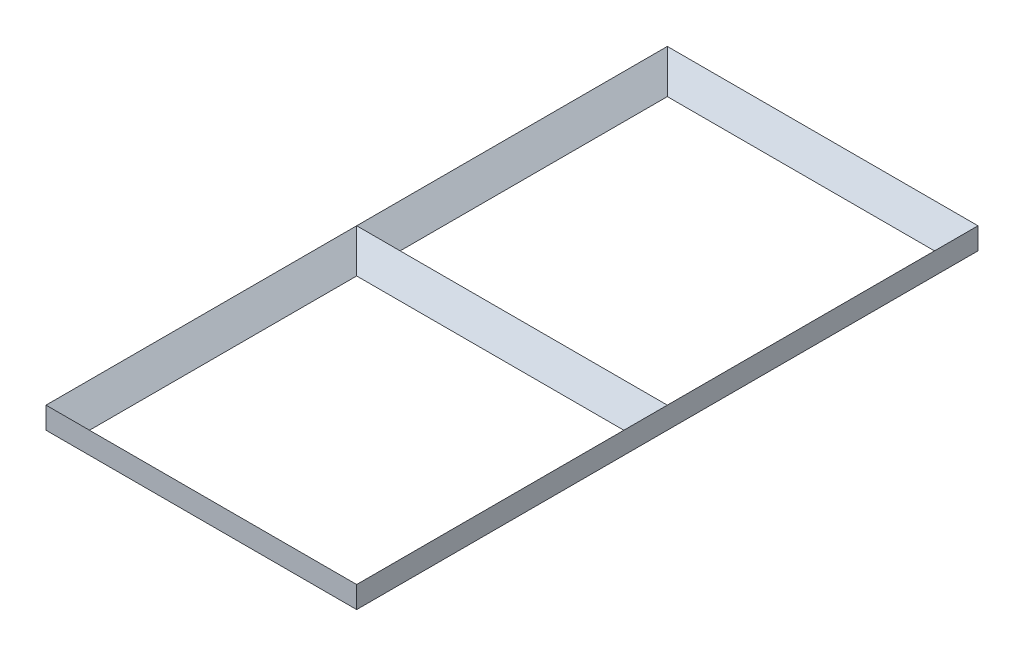
ISO-10303-21;
HEADER;
FILE_DESCRIPTION(('STEP AP214'),'2;1');
FILE_NAME('part.step','',(''),(''),'','','');
FILE_SCHEMA(('AUTOMOTIVE_DESIGN { 1 0 10303 214 1 1 1 1 }'));
ENDSEC;
DATA;
#1=APPLICATION_CONTEXT('core data for automotive mechanical design processes');
#2=APPLICATION_PROTOCOL_DEFINITION('international standard','automotive_design',2000,#1);
#3=PRODUCT_CONTEXT('',#1,'mechanical');
#4=PRODUCT('Part','Part','',(#3));
#5=PRODUCT_RELATED_PRODUCT_CATEGORY('part','',(#4));
#6=PRODUCT_DEFINITION_FORMATION('','',#4);
#7=PRODUCT_DEFINITION_CONTEXT('part definition',#1,'design');
#8=PRODUCT_DEFINITION('design','',#6,#7);
#9=PRODUCT_DEFINITION_SHAPE('','',#8);
#10=(LENGTH_UNIT() NAMED_UNIT(*) SI_UNIT(.MILLI.,.METRE.));
#11=(NAMED_UNIT(*) PLANE_ANGLE_UNIT() SI_UNIT($,.RADIAN.));
#12=(NAMED_UNIT(*) SI_UNIT($,.STERADIAN.) SOLID_ANGLE_UNIT());
#13=UNCERTAINTY_MEASURE_WITH_UNIT(LENGTH_MEASURE(1.E-05),#10,'distance_accuracy_value','');
#14=(GEOMETRIC_REPRESENTATION_CONTEXT(3) GLOBAL_UNCERTAINTY_ASSIGNED_CONTEXT((#13)) GLOBAL_UNIT_ASSIGNED_CONTEXT((#10,
#11,#12)) REPRESENTATION_CONTEXT('',''));
#15=CARTESIAN_POINT('',(0.,0.,0.));
#16=DIRECTION('',(0.,0.,1.));
#17=DIRECTION('',(1.,0.,0.));
#18=AXIS2_PLACEMENT_3D('',#15,#16,#17);
#19=CARTESIAN_POINT('',(50.,3.5,50.));
#20=DIRECTION('',(1.,0.,0.));
#21=DIRECTION('',(0.,0.,-1.));
#22=AXIS2_PLACEMENT_3D('',#19,#20,#21);
#23=PLANE('',#22);
#24=DIRECTION('',(0.,0.,1.));
#25=VECTOR('',#24,1.);
#26=CARTESIAN_POINT('',(50.,0.,50.));
#27=LINE('',#26,#25);
#28=CARTESIAN_POINT('',(50.,0.,-50.));
#29=VERTEX_POINT('',#28);
#30=CARTESIAN_POINT('',(50.,0.,50.));
#31=VERTEX_POINT('',#30);
#32=EDGE_CURVE('E90',#29,#31,#27,.T.);
#33=ORIENTED_EDGE('',*,*,#32,.F.);
#34=DIRECTION('',(0.,-1.,0.));
#35=VECTOR('',#34,1.);
#36=CARTESIAN_POINT('',(50.,3.5,-50.));
#37=LINE('',#36,#35);
#38=CARTESIAN_POINT('',(50.,3.5,-50.));
#39=VERTEX_POINT('',#38);
#40=EDGE_CURVE('E150',#39,#29,#37,.T.);
#41=ORIENTED_EDGE('',*,*,#40,.F.);
#42=DIRECTION('',(0.,0.,1.));
#43=VECTOR('',#42,1.);
#44=CARTESIAN_POINT('',(50.,3.5,0.));
#45=LINE('',#44,#43);
#46=CARTESIAN_POINT('',(50.,3.5,0.));
#47=VERTEX_POINT('',#46);
#48=EDGE_CURVE('E183',#39,#47,#45,.T.);
#49=ORIENTED_EDGE('',*,*,#48,.T.);
#50=DIRECTION('',(0.,0.,1.));
#51=VECTOR('',#50,1.);
#52=CARTESIAN_POINT('',(50.,3.5,50.));
#53=LINE('',#52,#51);
#54=CARTESIAN_POINT('',(50.,3.5,50.));
#55=VERTEX_POINT('',#54);
#56=EDGE_CURVE('E56',#47,#55,#53,.T.);
#57=ORIENTED_EDGE('',*,*,#56,.T.);
#58=DIRECTION('',(0.,-1.,0.));
#59=VECTOR('',#58,1.);
#60=CARTESIAN_POINT('',(50.,3.5,50.));
#61=LINE('',#60,#59);
#62=EDGE_CURVE('E49',#55,#31,#61,.T.);
#63=ORIENTED_EDGE('',*,*,#62,.T.);
#64=EDGE_LOOP('',(#33,#41,#49,#57,#63));
#65=FACE_BOUND('',#64,.T.);
#66=ADVANCED_FACE('F41',(#65),#23,.T.);
#67=CARTESIAN_POINT('',(0.,3.5,50.));
#68=DIRECTION('',(-1.,0.,0.));
#69=DIRECTION('',(0.,0.,1.));
#70=AXIS2_PLACEMENT_3D('',#67,#68,#69);
#71=PLANE('',#70);
#72=DIRECTION('',(0.,0.,-1.));
#73=VECTOR('',#72,1.);
#74=CARTESIAN_POINT('',(0.,0.,50.));
#75=LINE('',#74,#73);
#76=CARTESIAN_POINT('',(0.,0.,50.));
#77=VERTEX_POINT('',#76);
#78=CARTESIAN_POINT('',(0.,0.,-50.));
#79=VERTEX_POINT('',#78);
#80=EDGE_CURVE('E87',#77,#79,#75,.T.);
#81=ORIENTED_EDGE('',*,*,#80,.F.);
#82=DIRECTION('',(0.,-1.,0.));
#83=VECTOR('',#82,1.);
#84=CARTESIAN_POINT('',(0.,3.5,50.));
#85=LINE('',#84,#83);
#86=CARTESIAN_POINT('',(0.,3.5,50.));
#87=VERTEX_POINT('',#86);
#88=EDGE_CURVE('E11',#87,#77,#85,.T.);
#89=ORIENTED_EDGE('',*,*,#88,.F.);
#90=DIRECTION('',(0.,0.,-1.));
#91=VECTOR('',#90,1.);
#92=CARTESIAN_POINT('',(0.,3.5,50.));
#93=LINE('',#92,#91);
#94=CARTESIAN_POINT('',(0.,3.5,0.));
#95=VERTEX_POINT('',#94);
#96=EDGE_CURVE('E102',#87,#95,#93,.T.);
#97=ORIENTED_EDGE('',*,*,#96,.T.);
#98=DIRECTION('',(0.,0.,-1.));
#99=VECTOR('',#98,1.);
#100=CARTESIAN_POINT('',(0.,3.5,0.));
#101=LINE('',#100,#99);
#102=CARTESIAN_POINT('',(0.,3.5,-50.));
#103=VERTEX_POINT('',#102);
#104=EDGE_CURVE('E159',#95,#103,#101,.T.);
#105=ORIENTED_EDGE('',*,*,#104,.T.);
#106=DIRECTION('',(0.,-1.,0.));
#107=VECTOR('',#106,1.);
#108=CARTESIAN_POINT('',(0.,3.5,-50.));
#109=LINE('',#108,#107);
#110=EDGE_CURVE('E95',#103,#79,#109,.T.);
#111=ORIENTED_EDGE('',*,*,#110,.T.);
#112=EDGE_LOOP('',(#81,#89,#97,#105,#111));
#113=FACE_BOUND('',#112,.T.);
#114=ADVANCED_FACE('F92',(#113),#71,.T.);
#115=CARTESIAN_POINT('',(0.,3.5,50.));
#116=DIRECTION('',(0.,0.,-1.));
#117=DIRECTION('',(-1.,0.,0.));
#118=AXIS2_PLACEMENT_3D('',#115,#116,#117);
#119=PLANE('',#118);
#120=DIRECTION('',(1.,0.,0.));
#121=VECTOR('',#120,1.);
#122=CARTESIAN_POINT('',(0.,0.,50.));
#123=LINE('',#122,#121);
#124=EDGE_CURVE('E73',#77,#31,#123,.T.);
#125=ORIENTED_EDGE('',*,*,#124,.T.);
#126=ORIENTED_EDGE('',*,*,#62,.F.);
#127=DIRECTION('',(1.,0.,0.));
#128=VECTOR('',#127,1.);
#129=CARTESIAN_POINT('',(0.,3.5,50.));
#130=LINE('',#129,#128);
#131=EDGE_CURVE('E77',#87,#55,#130,.T.);
#132=ORIENTED_EDGE('',*,*,#131,.F.);
#133=ORIENTED_EDGE('',*,*,#88,.T.);
#134=EDGE_LOOP('',(#125,#126,#132,#133));
#135=FACE_BOUND('',#134,.T.);
#136=ADVANCED_FACE('F71',(#135),#119,.F.);
#137=CARTESIAN_POINT('',(0.,0.,50.));
#138=DIRECTION('',(0.,1.,0.));
#139=DIRECTION('',(0.,0.,1.));
#140=AXIS2_PLACEMENT_3D('',#137,#138,#139);
#141=PLANE('',#140);
#142=DIRECTION('',(1.,0.,0.));
#143=VECTOR('',#142,1.);
#144=CARTESIAN_POINT('',(0.,0.,46.5));
#145=LINE('',#144,#143);
#146=CARTESIAN_POINT('',(3.5,0.,46.5));
#147=VERTEX_POINT('',#146);
#148=CARTESIAN_POINT('',(46.5,0.,46.5));
#149=VERTEX_POINT('',#148);
#150=EDGE_CURVE('E111',#147,#149,#145,.T.);
#151=ORIENTED_EDGE('',*,*,#150,.T.);
#152=DIRECTION('',(0.,0.,1.));
#153=VECTOR('',#152,1.);
#154=CARTESIAN_POINT('',(46.5,0.,50.));
#155=LINE('',#154,#153);
#156=CARTESIAN_POINT('',(46.5,0.,3.5));
#157=VERTEX_POINT('',#156);
#158=EDGE_CURVE('E98',#157,#149,#155,.T.);
#159=ORIENTED_EDGE('',*,*,#158,.F.);
#160=DIRECTION('',(1.,0.,0.));
#161=VECTOR('',#160,1.);
#162=CARTESIAN_POINT('',(0.,0.,3.5));
#163=LINE('',#162,#161);
#164=CARTESIAN_POINT('',(3.5,0.,3.5));
#165=VERTEX_POINT('',#164);
#166=EDGE_CURVE('E117',#165,#157,#163,.T.);
#167=ORIENTED_EDGE('',*,*,#166,.F.);
#168=DIRECTION('',(0.,0.,-1.));
#169=VECTOR('',#168,1.);
#170=CARTESIAN_POINT('',(3.5,0.,50.));
#171=LINE('',#170,#169);
#172=EDGE_CURVE('E114',#147,#165,#171,.T.);
#173=ORIENTED_EDGE('',*,*,#172,.F.);
#174=EDGE_LOOP('',(#151,#159,#167,#173));
#175=FACE_BOUND('',#174,.T.);
#176=ORIENTED_EDGE('',*,*,#32,.T.);
#177=ORIENTED_EDGE('',*,*,#124,.F.);
#178=ORIENTED_EDGE('',*,*,#80,.T.);
#179=DIRECTION('',(1.,0.,0.));
#180=VECTOR('',#179,1.);
#181=CARTESIAN_POINT('',(0.,0.,-50.));
#182=LINE('',#181,#180);
#183=EDGE_CURVE('E196',#79,#29,#182,.T.);
#184=ORIENTED_EDGE('',*,*,#183,.T.);
#185=EDGE_LOOP('',(#176,#177,#178,#184));
#186=FACE_BOUND('',#185,.T.);
#187=DIRECTION('',(1.,0.,0.));
#188=VECTOR('',#187,1.);
#189=CARTESIAN_POINT('',(0.,0.,-3.5));
#190=LINE('',#189,#188);
#191=CARTESIAN_POINT('',(3.5,0.,-3.5));
#192=VERTEX_POINT('',#191);
#193=CARTESIAN_POINT('',(46.5,0.,-3.5));
#194=VERTEX_POINT('',#193);
#195=EDGE_CURVE('E169',#192,#194,#190,.T.);
#196=ORIENTED_EDGE('',*,*,#195,.T.);
#197=DIRECTION('',(0.,0.,1.));
#198=VECTOR('',#197,1.);
#199=CARTESIAN_POINT('',(46.5,0.,0.));
#200=LINE('',#199,#198);
#201=CARTESIAN_POINT('',(46.5,0.,-46.5));
#202=VERTEX_POINT('',#201);
#203=EDGE_CURVE('E193',#202,#194,#200,.T.);
#204=ORIENTED_EDGE('',*,*,#203,.F.);
#205=DIRECTION('',(1.,0.,0.));
#206=VECTOR('',#205,1.);
#207=CARTESIAN_POINT('',(0.,0.,-46.5));
#208=LINE('',#207,#206);
#209=CARTESIAN_POINT('',(3.5,0.,-46.5));
#210=VERTEX_POINT('',#209);
#211=EDGE_CURVE('E190',#210,#202,#208,.T.);
#212=ORIENTED_EDGE('',*,*,#211,.F.);
#213=DIRECTION('',(0.,0.,-1.));
#214=VECTOR('',#213,1.);
#215=CARTESIAN_POINT('',(3.5,0.,0.));
#216=LINE('',#215,#214);
#217=EDGE_CURVE('E188',#192,#210,#216,.T.);
#218=ORIENTED_EDGE('',*,*,#217,.F.);
#219=EDGE_LOOP('',(#196,#204,#212,#218));
#220=FACE_BOUND('',#219,.T.);
#221=ADVANCED_FACE('F83',(#175,#186,#220),#141,.F.);
#222=CARTESIAN_POINT('',(3.5,0.,50.));
#223=DIRECTION('',(-0.707106781186546,-0.707106781186549,0.));
#224=DIRECTION('',(0.707106781186549,-0.707106781186546,0.));
#225=AXIS2_PLACEMENT_3D('',#222,#223,#224);
#226=PLANE('',#225);
#227=ORIENTED_EDGE('',*,*,#172,.T.);
#228=DIRECTION('',(0.577350269189627,-0.577350269189624,0.577350269189627));
#229=VECTOR('',#228,1.);
#230=CARTESIAN_POINT('',(19.,-15.5,19.));
#231=LINE('',#230,#229);
#232=EDGE_CURVE('E146',#95,#165,#231,.T.);
#233=ORIENTED_EDGE('',*,*,#232,.F.);
#234=ORIENTED_EDGE('',*,*,#96,.F.);
#235=DIRECTION('',(-0.577350269189627,0.577350269189624,0.577350269189627));
#236=VECTOR('',#235,1.);
#237=CARTESIAN_POINT('',(2.33333333333333,1.16666666666667,47.6666666666667));
#238=LINE('',#237,#236);
#239=EDGE_CURVE('E115',#87,#147,#238,.F.);
#240=ORIENTED_EDGE('',*,*,#239,.T.);
#241=EDGE_LOOP('',(#227,#233,#234,#240));
#242=FACE_BOUND('',#241,.T.);
#243=ADVANCED_FACE('F148',(#242),#226,.F.);
#244=CARTESIAN_POINT('',(0.,0.,46.5));
#245=DIRECTION('',(0.,-0.707106781186549,0.707106781186546));
#246=DIRECTION('',(0.,-0.707106781186546,-0.707106781186549));
#247=AXIS2_PLACEMENT_3D('',#244,#245,#246);
#248=PLANE('',#247);
#249=ORIENTED_EDGE('',*,*,#150,.F.);
#250=ORIENTED_EDGE('',*,*,#239,.F.);
#251=ORIENTED_EDGE('',*,*,#131,.T.);
#252=DIRECTION('',(0.577350269189627,0.577350269189624,0.577350269189627));
#253=VECTOR('',#252,1.);
#254=CARTESIAN_POINT('',(31.,-15.5,31.));
#255=LINE('',#254,#253);
#256=EDGE_CURVE('E123',#55,#149,#255,.F.);
#257=ORIENTED_EDGE('',*,*,#256,.T.);
#258=EDGE_LOOP('',(#249,#250,#251,#257));
#259=FACE_BOUND('',#258,.T.);
#260=ADVANCED_FACE('F132',(#259),#248,.F.);
#261=CARTESIAN_POINT('',(46.5,0.,50.));
#262=DIRECTION('',(0.707106781186546,-0.707106781186549,0.));
#263=DIRECTION('',(0.707106781186549,0.707106781186546,0.));
#264=AXIS2_PLACEMENT_3D('',#261,#262,#263);
#265=PLANE('',#264);
#266=ORIENTED_EDGE('',*,*,#158,.T.);
#267=ORIENTED_EDGE('',*,*,#256,.F.);
#268=ORIENTED_EDGE('',*,*,#56,.F.);
#269=DIRECTION('',(-0.577350269189626,-0.577350269189624,0.577350269189627));
#270=VECTOR('',#269,1.);
#271=CARTESIAN_POINT('',(31.,-15.5,19.));
#272=LINE('',#271,#270);
#273=EDGE_CURVE('E125',#47,#157,#272,.T.);
#274=ORIENTED_EDGE('',*,*,#273,.T.);
#275=EDGE_LOOP('',(#266,#267,#268,#274));
#276=FACE_BOUND('',#275,.T.);
#277=ADVANCED_FACE('F122',(#276),#265,.F.);
#278=CARTESIAN_POINT('',(0.,0.,3.5));
#279=DIRECTION('',(0.,-0.707106781186549,-0.707106781186546));
#280=DIRECTION('',(0.,0.707106781186546,-0.707106781186549));
#281=AXIS2_PLACEMENT_3D('',#278,#279,#280);
#282=PLANE('',#281);
#283=ORIENTED_EDGE('',*,*,#166,.T.);
#284=ORIENTED_EDGE('',*,*,#273,.F.);
#285=DIRECTION('',(1.,0.,0.));
#286=VECTOR('',#285,1.);
#287=CARTESIAN_POINT('',(0.,3.5,0.));
#288=LINE('',#287,#286);
#289=EDGE_CURVE('E153',#95,#47,#288,.T.);
#290=ORIENTED_EDGE('',*,*,#289,.F.);
#291=ORIENTED_EDGE('',*,*,#232,.T.);
#292=EDGE_LOOP('',(#283,#284,#290,#291));
#293=FACE_BOUND('',#292,.T.);
#294=ADVANCED_FACE('F154',(#293),#282,.F.);
#295=CARTESIAN_POINT('',(0.,3.5,-50.));
#296=DIRECTION('',(0.,0.,-1.));
#297=DIRECTION('',(-1.,0.,0.));
#298=AXIS2_PLACEMENT_3D('',#295,#296,#297);
#299=PLANE('',#298);
#300=ORIENTED_EDGE('',*,*,#183,.F.);
#301=ORIENTED_EDGE('',*,*,#110,.F.);
#302=DIRECTION('',(1.,0.,0.));
#303=VECTOR('',#302,1.);
#304=CARTESIAN_POINT('',(0.,3.5,-50.));
#305=LINE('',#304,#303);
#306=EDGE_CURVE('E180',#103,#39,#305,.T.);
#307=ORIENTED_EDGE('',*,*,#306,.T.);
#308=ORIENTED_EDGE('',*,*,#40,.T.);
#309=EDGE_LOOP('',(#300,#301,#307,#308));
#310=FACE_BOUND('',#309,.T.);
#311=ADVANCED_FACE('F227',(#310),#299,.T.);
#312=CARTESIAN_POINT('',(3.5,0.,0.));
#313=DIRECTION('',(-0.707106781186546,-0.707106781186549,0.));
#314=DIRECTION('',(0.707106781186549,-0.707106781186546,0.));
#315=AXIS2_PLACEMENT_3D('',#312,#313,#314);
#316=PLANE('',#315);
#317=ORIENTED_EDGE('',*,*,#217,.T.);
#318=DIRECTION('',(0.577350269189627,-0.577350269189624,0.577350269189627));
#319=VECTOR('',#318,1.);
#320=CARTESIAN_POINT('',(19.,-15.5,-31.));
#321=LINE('',#320,#319);
#322=EDGE_CURVE('E178',#103,#210,#321,.T.);
#323=ORIENTED_EDGE('',*,*,#322,.F.);
#324=ORIENTED_EDGE('',*,*,#104,.F.);
#325=DIRECTION('',(-0.577350269189627,0.577350269189624,0.577350269189627));
#326=VECTOR('',#325,1.);
#327=CARTESIAN_POINT('',(2.33333333333333,1.16666666666667,-2.33333333333333));
#328=LINE('',#327,#326);
#329=EDGE_CURVE('E165',#95,#192,#328,.F.);
#330=ORIENTED_EDGE('',*,*,#329,.T.);
#331=EDGE_LOOP('',(#317,#323,#324,#330));
#332=FACE_BOUND('',#331,.T.);
#333=ADVANCED_FACE('F176',(#332),#316,.F.);
#334=CARTESIAN_POINT('',(0.,0.,-3.5));
#335=DIRECTION('',(0.,-0.707106781186549,0.707106781186546));
#336=DIRECTION('',(0.,-0.707106781186546,-0.707106781186549));
#337=AXIS2_PLACEMENT_3D('',#334,#335,#336);
#338=PLANE('',#337);
#339=ORIENTED_EDGE('',*,*,#195,.F.);
#340=ORIENTED_EDGE('',*,*,#329,.F.);
#341=ORIENTED_EDGE('',*,*,#289,.T.);
#342=DIRECTION('',(0.577350269189627,0.577350269189624,0.577350269189627));
#343=VECTOR('',#342,1.);
#344=CARTESIAN_POINT('',(31.,-15.5,-19.));
#345=LINE('',#344,#343);
#346=EDGE_CURVE('E173',#47,#194,#345,.F.);
#347=ORIENTED_EDGE('',*,*,#346,.T.);
#348=EDGE_LOOP('',(#339,#340,#341,#347));
#349=FACE_BOUND('',#348,.T.);
#350=ADVANCED_FACE('F166',(#349),#338,.F.);
#351=CARTESIAN_POINT('',(46.5,0.,0.));
#352=DIRECTION('',(0.707106781186546,-0.707106781186549,0.));
#353=DIRECTION('',(0.707106781186549,0.707106781186546,0.));
#354=AXIS2_PLACEMENT_3D('',#351,#352,#353);
#355=PLANE('',#354);
#356=ORIENTED_EDGE('',*,*,#203,.T.);
#357=ORIENTED_EDGE('',*,*,#346,.F.);
#358=ORIENTED_EDGE('',*,*,#48,.F.);
#359=DIRECTION('',(-0.577350269189626,-0.577350269189624,0.577350269189627));
#360=VECTOR('',#359,1.);
#361=CARTESIAN_POINT('',(31.,-15.5,-31.));
#362=LINE('',#361,#360);
#363=EDGE_CURVE('E210',#39,#202,#362,.T.);
#364=ORIENTED_EDGE('',*,*,#363,.T.);
#365=EDGE_LOOP('',(#356,#357,#358,#364));
#366=FACE_BOUND('',#365,.T.);
#367=ADVANCED_FACE('F222',(#366),#355,.F.);
#368=CARTESIAN_POINT('',(0.,0.,-46.5));
#369=DIRECTION('',(0.,-0.707106781186549,-0.707106781186546));
#370=DIRECTION('',(0.,0.707106781186546,-0.707106781186549));
#371=AXIS2_PLACEMENT_3D('',#368,#369,#370);
#372=PLANE('',#371);
#373=ORIENTED_EDGE('',*,*,#211,.T.);
#374=ORIENTED_EDGE('',*,*,#363,.F.);
#375=ORIENTED_EDGE('',*,*,#306,.F.);
#376=ORIENTED_EDGE('',*,*,#322,.T.);
#377=EDGE_LOOP('',(#373,#374,#375,#376));
#378=FACE_BOUND('',#377,.T.);
#379=ADVANCED_FACE('F215',(#378),#372,.F.);
#380=CLOSED_SHELL('',(#66,#114,#136,#221,#243,#260,#277,#294,#311,#333,#350,#367,#379));
#381=MANIFOLD_SOLID_BREP('B2',#380);
#382=ADVANCED_BREP_SHAPE_REPRESENTATION('',(#18,#381),#14);
#383=SHAPE_DEFINITION_REPRESENTATION(#9,#382);
ENDSEC;
END-ISO-10303-21;
